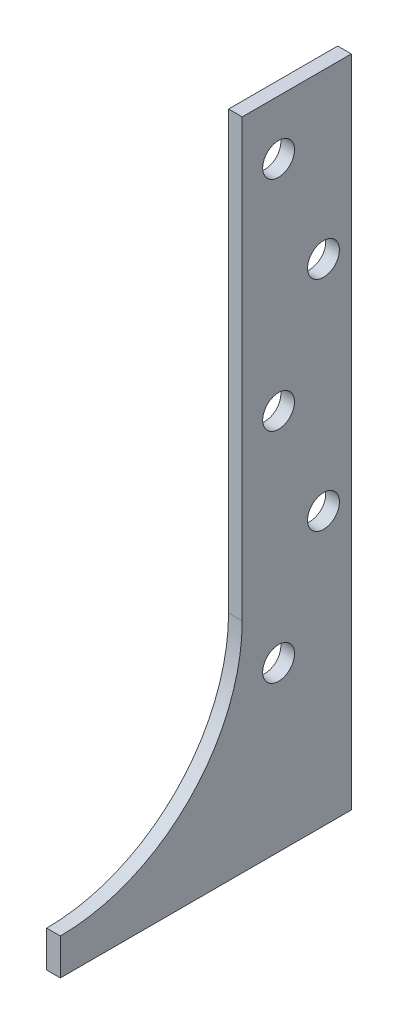
ISO-10303-21;
HEADER;
FILE_DESCRIPTION(('STEP AP214'),'2;1');
FILE_NAME('part.step','',(''),(''),'','','');
FILE_SCHEMA(('AUTOMOTIVE_DESIGN { 1 0 10303 214 1 1 1 1 }'));
ENDSEC;
DATA;
#1=APPLICATION_CONTEXT('core data for automotive mechanical design processes');
#2=APPLICATION_PROTOCOL_DEFINITION('international standard','automotive_design',2000,#1);
#3=PRODUCT_CONTEXT('',#1,'mechanical');
#4=PRODUCT('Part','Part','',(#3));
#5=PRODUCT_RELATED_PRODUCT_CATEGORY('part','',(#4));
#6=PRODUCT_DEFINITION_FORMATION('','',#4);
#7=PRODUCT_DEFINITION_CONTEXT('part definition',#1,'design');
#8=PRODUCT_DEFINITION('design','',#6,#7);
#9=PRODUCT_DEFINITION_SHAPE('','',#8);
#10=(LENGTH_UNIT() NAMED_UNIT(*) SI_UNIT(.MILLI.,.METRE.));
#11=(NAMED_UNIT(*) PLANE_ANGLE_UNIT() SI_UNIT($,.RADIAN.));
#12=(NAMED_UNIT(*) SI_UNIT($,.STERADIAN.) SOLID_ANGLE_UNIT());
#13=UNCERTAINTY_MEASURE_WITH_UNIT(LENGTH_MEASURE(1.E-05),#10,'distance_accuracy_value','');
#14=(GEOMETRIC_REPRESENTATION_CONTEXT(3) GLOBAL_UNCERTAINTY_ASSIGNED_CONTEXT((#13)) GLOBAL_UNIT_ASSIGNED_CONTEXT((#10,
#11,#12)) REPRESENTATION_CONTEXT('',''));
#15=CARTESIAN_POINT('',(0.,0.,0.));
#16=DIRECTION('',(0.,0.,1.));
#17=DIRECTION('',(1.,0.,0.));
#18=AXIS2_PLACEMENT_3D('',#15,#16,#17);
#19=CARTESIAN_POINT('',(19.05,304.8,406.4));
#20=DIRECTION('',(-1.,0.,0.));
#21=DIRECTION('',(0.,0.,1.));
#22=AXIS2_PLACEMENT_3D('',#19,#20,#21);
#23=PLANE('',#22);
#24=CARTESIAN_POINT('',(19.05,533.4,101.6));
#25=DIRECTION('',(1.,0.,0.));
#26=DIRECTION('',(0.,0.,-1.));
#27=AXIS2_PLACEMENT_3D('',#24,#25,#26);
#28=CIRCLE('',#27,22.225);
#29=CARTESIAN_POINT('',(19.05,533.4,123.825));
#30=VERTEX_POINT('',#29);
#31=EDGE_CURVE('E193',#30,#30,#28,.T.);
#32=ORIENTED_EDGE('',*,*,#31,.F.);
#33=EDGE_LOOP('',(#32));
#34=FACE_BOUND('',#33,.T.);
#35=CARTESIAN_POINT('',(19.05,838.2,101.6));
#36=DIRECTION('',(1.,0.,0.));
#37=DIRECTION('',(0.,0.,-1.));
#38=AXIS2_PLACEMENT_3D('',#35,#36,#37);
#39=CIRCLE('',#38,22.225);
#40=CARTESIAN_POINT('',(19.05,838.2,123.825));
#41=VERTEX_POINT('',#40);
#42=EDGE_CURVE('E205',#41,#41,#39,.T.);
#43=ORIENTED_EDGE('',*,*,#42,.F.);
#44=EDGE_LOOP('',(#43));
#45=FACE_BOUND('',#44,.T.);
#46=DIRECTION('',(0.,1.,0.));
#47=VECTOR('',#46,1.);
#48=CARTESIAN_POINT('',(19.05,914.4,0.));
#49=LINE('',#48,#47);
#50=CARTESIAN_POINT('',(19.05,0.,0.));
#51=VERTEX_POINT('',#50);
#52=CARTESIAN_POINT('',(19.05,914.4,0.));
#53=VERTEX_POINT('',#52);
#54=EDGE_CURVE('E128',#51,#53,#49,.T.);
#55=ORIENTED_EDGE('',*,*,#54,.T.);
#56=DIRECTION('',(0.,0.,1.));
#57=VECTOR('',#56,1.);
#58=CARTESIAN_POINT('',(19.05,914.4,152.4));
#59=LINE('',#58,#57);
#60=CARTESIAN_POINT('',(19.05,914.4,152.4));
#61=VERTEX_POINT('',#60);
#62=EDGE_CURVE('E86',#53,#61,#59,.T.);
#63=ORIENTED_EDGE('',*,*,#62,.T.);
#64=DIRECTION('',(0.,-1.,0.));
#65=VECTOR('',#64,1.);
#66=CARTESIAN_POINT('',(19.05,914.4,152.4));
#67=LINE('',#66,#65);
#68=CARTESIAN_POINT('',(19.05,304.8,152.4));
#69=VERTEX_POINT('',#68);
#70=EDGE_CURVE('E99',#61,#69,#67,.T.);
#71=ORIENTED_EDGE('',*,*,#70,.T.);
#72=CARTESIAN_POINT('',(19.05,304.8,406.4));
#73=DIRECTION('',(-1.,0.,0.));
#74=DIRECTION('',(0.,0.,1.));
#75=AXIS2_PLACEMENT_3D('',#72,#73,#74);
#76=CIRCLE('',#75,254.);
#77=CARTESIAN_POINT('',(19.05,50.7999999999999,406.4));
#78=VERTEX_POINT('',#77);
#79=EDGE_CURVE('E93',#69,#78,#76,.T.);
#80=ORIENTED_EDGE('',*,*,#79,.T.);
#81=DIRECTION('',(0.,-1.,0.));
#82=VECTOR('',#81,1.);
#83=CARTESIAN_POINT('',(19.05,0.,406.4));
#84=LINE('',#83,#82);
#85=CARTESIAN_POINT('',(19.05,0.,406.4));
#86=VERTEX_POINT('',#85);
#87=EDGE_CURVE('E97',#78,#86,#84,.T.);
#88=ORIENTED_EDGE('',*,*,#87,.T.);
#89=DIRECTION('',(0.,0.,-1.));
#90=VECTOR('',#89,1.);
#91=CARTESIAN_POINT('',(19.05,0.,0.));
#92=LINE('',#91,#90);
#93=EDGE_CURVE('E49',#86,#51,#92,.T.);
#94=ORIENTED_EDGE('',*,*,#93,.T.);
#95=EDGE_LOOP('',(#55,#63,#71,#80,#88,#94));
#96=FACE_BOUND('',#95,.T.);
#97=CARTESIAN_POINT('',(19.05,685.8,38.8738267968174));
#98=DIRECTION('',(1.,0.,0.));
#99=DIRECTION('',(0.,0.,-1.));
#100=AXIS2_PLACEMENT_3D('',#97,#98,#99);
#101=CIRCLE('',#100,22.225);
#102=CARTESIAN_POINT('',(19.05,685.8,61.0988267968174));
#103=VERTEX_POINT('',#102);
#104=EDGE_CURVE('E121',#103,#103,#101,.T.);
#105=ORIENTED_EDGE('',*,*,#104,.F.);
#106=EDGE_LOOP('',(#105));
#107=FACE_BOUND('',#106,.T.);
#108=CARTESIAN_POINT('',(19.05,381.,38.8738267968174));
#109=DIRECTION('',(1.,0.,0.));
#110=DIRECTION('',(0.,0.,-1.));
#111=AXIS2_PLACEMENT_3D('',#108,#109,#110);
#112=CIRCLE('',#111,22.225);
#113=CARTESIAN_POINT('',(19.05,381.,61.0988267968174));
#114=VERTEX_POINT('',#113);
#115=EDGE_CURVE('E199',#114,#114,#112,.T.);
#116=ORIENTED_EDGE('',*,*,#115,.F.);
#117=EDGE_LOOP('',(#116));
#118=FACE_BOUND('',#117,.T.);
#119=CARTESIAN_POINT('',(19.05,228.6,101.6));
#120=DIRECTION('',(1.,0.,0.));
#121=DIRECTION('',(0.,0.,-1.));
#122=AXIS2_PLACEMENT_3D('',#119,#120,#121);
#123=CIRCLE('',#122,22.225);
#124=CARTESIAN_POINT('',(19.05,228.6,123.825));
#125=VERTEX_POINT('',#124);
#126=EDGE_CURVE('E184',#125,#125,#123,.T.);
#127=ORIENTED_EDGE('',*,*,#126,.F.);
#128=EDGE_LOOP('',(#127));
#129=FACE_BOUND('',#128,.T.);
#130=ADVANCED_FACE('F32',(#34,#45,#96,#107,#118,#129),#23,.F.);
#131=CARTESIAN_POINT('',(0.,304.8,406.4));
#132=DIRECTION('',(-1.,0.,0.));
#133=DIRECTION('',(0.,0.,1.));
#134=AXIS2_PLACEMENT_3D('',#131,#132,#133);
#135=PLANE('',#134);
#136=CARTESIAN_POINT('',(0.,533.4,101.6));
#137=DIRECTION('',(1.,0.,0.));
#138=DIRECTION('',(0.,0.,-1.));
#139=AXIS2_PLACEMENT_3D('',#136,#137,#138);
#140=CIRCLE('',#139,22.225);
#141=CARTESIAN_POINT('',(0.,533.4,123.825));
#142=VERTEX_POINT('',#141);
#143=EDGE_CURVE('E190',#142,#142,#140,.T.);
#144=ORIENTED_EDGE('',*,*,#143,.T.);
#145=EDGE_LOOP('',(#144));
#146=FACE_BOUND('',#145,.T.);
#147=CARTESIAN_POINT('',(0.,838.2,101.6));
#148=DIRECTION('',(1.,0.,0.));
#149=DIRECTION('',(0.,0.,-1.));
#150=AXIS2_PLACEMENT_3D('',#147,#148,#149);
#151=CIRCLE('',#150,22.225);
#152=CARTESIAN_POINT('',(0.,838.2,123.825));
#153=VERTEX_POINT('',#152);
#154=EDGE_CURVE('E202',#153,#153,#151,.T.);
#155=ORIENTED_EDGE('',*,*,#154,.T.);
#156=EDGE_LOOP('',(#155));
#157=FACE_BOUND('',#156,.T.);
#158=DIRECTION('',(0.,1.,0.));
#159=VECTOR('',#158,1.);
#160=CARTESIAN_POINT('',(0.,914.4,0.));
#161=LINE('',#160,#159);
#162=CARTESIAN_POINT('',(0.,0.,0.));
#163=VERTEX_POINT('',#162);
#164=CARTESIAN_POINT('',(0.,914.4,0.));
#165=VERTEX_POINT('',#164);
#166=EDGE_CURVE('E117',#163,#165,#161,.T.);
#167=ORIENTED_EDGE('',*,*,#166,.F.);
#168=DIRECTION('',(0.,0.,-1.));
#169=VECTOR('',#168,1.);
#170=CARTESIAN_POINT('',(0.,0.,0.));
#171=LINE('',#170,#169);
#172=CARTESIAN_POINT('',(0.,0.,406.4));
#173=VERTEX_POINT('',#172);
#174=EDGE_CURVE('E78',#173,#163,#171,.T.);
#175=ORIENTED_EDGE('',*,*,#174,.F.);
#176=DIRECTION('',(0.,-1.,0.));
#177=VECTOR('',#176,1.);
#178=CARTESIAN_POINT('',(0.,0.,406.4));
#179=LINE('',#178,#177);
#180=CARTESIAN_POINT('',(0.,50.7999999999999,406.4));
#181=VERTEX_POINT('',#180);
#182=EDGE_CURVE('E72',#181,#173,#179,.T.);
#183=ORIENTED_EDGE('',*,*,#182,.F.);
#184=CARTESIAN_POINT('',(0.,304.8,406.4));
#185=DIRECTION('',(-1.,0.,0.));
#186=DIRECTION('',(0.,0.,1.));
#187=AXIS2_PLACEMENT_3D('',#184,#185,#186);
#188=CIRCLE('',#187,254.);
#189=CARTESIAN_POINT('',(0.,304.8,152.4));
#190=VERTEX_POINT('',#189);
#191=EDGE_CURVE('E107',#190,#181,#188,.T.);
#192=ORIENTED_EDGE('',*,*,#191,.F.);
#193=DIRECTION('',(0.,-1.,0.));
#194=VECTOR('',#193,1.);
#195=CARTESIAN_POINT('',(0.,914.4,152.4));
#196=LINE('',#195,#194);
#197=CARTESIAN_POINT('',(0.,914.4,152.4));
#198=VERTEX_POINT('',#197);
#199=EDGE_CURVE('E123',#198,#190,#196,.T.);
#200=ORIENTED_EDGE('',*,*,#199,.F.);
#201=DIRECTION('',(0.,0.,1.));
#202=VECTOR('',#201,1.);
#203=CARTESIAN_POINT('',(0.,914.4,152.4));
#204=LINE('',#203,#202);
#205=EDGE_CURVE('E120',#165,#198,#204,.T.);
#206=ORIENTED_EDGE('',*,*,#205,.F.);
#207=EDGE_LOOP('',(#167,#175,#183,#192,#200,#206));
#208=FACE_BOUND('',#207,.T.);
#209=CARTESIAN_POINT('',(0.,685.8,38.8738267968174));
#210=DIRECTION('',(1.,0.,0.));
#211=DIRECTION('',(0.,0.,-1.));
#212=AXIS2_PLACEMENT_3D('',#209,#210,#211);
#213=CIRCLE('',#212,22.225);
#214=CARTESIAN_POINT('',(0.,685.8,61.0988267968174));
#215=VERTEX_POINT('',#214);
#216=EDGE_CURVE('E208',#215,#215,#213,.T.);
#217=ORIENTED_EDGE('',*,*,#216,.T.);
#218=EDGE_LOOP('',(#217));
#219=FACE_BOUND('',#218,.T.);
#220=CARTESIAN_POINT('',(0.,381.,38.8738267968174));
#221=DIRECTION('',(1.,0.,0.));
#222=DIRECTION('',(0.,0.,-1.));
#223=AXIS2_PLACEMENT_3D('',#220,#221,#222);
#224=CIRCLE('',#223,22.225);
#225=CARTESIAN_POINT('',(0.,381.,61.0988267968174));
#226=VERTEX_POINT('',#225);
#227=EDGE_CURVE('E196',#226,#226,#224,.T.);
#228=ORIENTED_EDGE('',*,*,#227,.T.);
#229=EDGE_LOOP('',(#228));
#230=FACE_BOUND('',#229,.T.);
#231=CARTESIAN_POINT('',(0.,228.6,101.6));
#232=DIRECTION('',(1.,0.,0.));
#233=DIRECTION('',(0.,0.,-1.));
#234=AXIS2_PLACEMENT_3D('',#231,#232,#233);
#235=CIRCLE('',#234,22.225);
#236=CARTESIAN_POINT('',(0.,228.6,123.825));
#237=VERTEX_POINT('',#236);
#238=EDGE_CURVE('E187',#237,#237,#235,.T.);
#239=ORIENTED_EDGE('',*,*,#238,.T.);
#240=EDGE_LOOP('',(#239));
#241=FACE_BOUND('',#240,.T.);
#242=ADVANCED_FACE('F137',(#146,#157,#208,#219,#230,#241),#135,.T.);
#243=CARTESIAN_POINT('',(19.05,914.4,0.));
#244=DIRECTION('',(0.,0.,1.));
#245=DIRECTION('',(0.,-1.,0.));
#246=AXIS2_PLACEMENT_3D('',#243,#244,#245);
#247=PLANE('',#246);
#248=ORIENTED_EDGE('',*,*,#166,.T.);
#249=DIRECTION('',(-1.,0.,0.));
#250=VECTOR('',#249,1.);
#251=CARTESIAN_POINT('',(19.05,914.4,0.));
#252=LINE('',#251,#250);
#253=EDGE_CURVE('E11',#53,#165,#252,.T.);
#254=ORIENTED_EDGE('',*,*,#253,.F.);
#255=ORIENTED_EDGE('',*,*,#54,.F.);
#256=DIRECTION('',(-1.,0.,0.));
#257=VECTOR('',#256,1.);
#258=CARTESIAN_POINT('',(19.05,0.,0.));
#259=LINE('',#258,#257);
#260=EDGE_CURVE('E113',#51,#163,#259,.T.);
#261=ORIENTED_EDGE('',*,*,#260,.T.);
#262=EDGE_LOOP('',(#248,#254,#255,#261));
#263=FACE_BOUND('',#262,.T.);
#264=ADVANCED_FACE('F34',(#263),#247,.F.);
#265=CARTESIAN_POINT('',(19.05,914.4,152.4));
#266=DIRECTION('',(0.,-1.,0.));
#267=DIRECTION('',(0.,0.,-1.));
#268=AXIS2_PLACEMENT_3D('',#265,#266,#267);
#269=PLANE('',#268);
#270=ORIENTED_EDGE('',*,*,#205,.T.);
#271=DIRECTION('',(-1.,0.,0.));
#272=VECTOR('',#271,1.);
#273=CARTESIAN_POINT('',(19.05,914.4,152.4));
#274=LINE('',#273,#272);
#275=EDGE_CURVE('E41',#61,#198,#274,.T.);
#276=ORIENTED_EDGE('',*,*,#275,.F.);
#277=ORIENTED_EDGE('',*,*,#62,.F.);
#278=ORIENTED_EDGE('',*,*,#253,.T.);
#279=EDGE_LOOP('',(#270,#276,#277,#278));
#280=FACE_BOUND('',#279,.T.);
#281=ADVANCED_FACE('F274',(#280),#269,.F.);
#282=CARTESIAN_POINT('',(19.05,914.4,152.4));
#283=DIRECTION('',(0.,0.,-1.));
#284=DIRECTION('',(0.,1.,0.));
#285=AXIS2_PLACEMENT_3D('',#282,#283,#284);
#286=PLANE('',#285);
#287=ORIENTED_EDGE('',*,*,#199,.T.);
#288=DIRECTION('',(-1.,0.,0.));
#289=VECTOR('',#288,1.);
#290=CARTESIAN_POINT('',(19.05,304.8,152.4));
#291=LINE('',#290,#289);
#292=EDGE_CURVE('E108',#69,#190,#291,.T.);
#293=ORIENTED_EDGE('',*,*,#292,.F.);
#294=ORIENTED_EDGE('',*,*,#70,.F.);
#295=ORIENTED_EDGE('',*,*,#275,.T.);
#296=EDGE_LOOP('',(#287,#293,#294,#295));
#297=FACE_BOUND('',#296,.T.);
#298=ADVANCED_FACE('F134',(#297),#286,.F.);
#299=CARTESIAN_POINT('',(19.05,304.8,406.4));
#300=DIRECTION('',(-1.,0.,0.));
#301=DIRECTION('',(0.,0.,1.));
#302=AXIS2_PLACEMENT_3D('',#299,#300,#301);
#303=CYLINDRICAL_SURFACE('',#302,254.);
#304=ORIENTED_EDGE('',*,*,#191,.T.);
#305=DIRECTION('',(-1.,0.,0.));
#306=VECTOR('',#305,1.);
#307=CARTESIAN_POINT('',(19.05,50.7999999999999,406.4));
#308=LINE('',#307,#306);
#309=EDGE_CURVE('E104',#78,#181,#308,.T.);
#310=ORIENTED_EDGE('',*,*,#309,.F.);
#311=ORIENTED_EDGE('',*,*,#79,.F.);
#312=ORIENTED_EDGE('',*,*,#292,.T.);
#313=EDGE_LOOP('',(#304,#310,#311,#312));
#314=FACE_BOUND('',#313,.T.);
#315=ADVANCED_FACE('F105',(#314),#303,.F.);
#316=CARTESIAN_POINT('',(19.05,0.,406.4));
#317=DIRECTION('',(0.,0.,-1.));
#318=DIRECTION('',(0.,1.,0.));
#319=AXIS2_PLACEMENT_3D('',#316,#317,#318);
#320=PLANE('',#319);
#321=ORIENTED_EDGE('',*,*,#182,.T.);
#322=DIRECTION('',(-1.,0.,0.));
#323=VECTOR('',#322,1.);
#324=CARTESIAN_POINT('',(19.05,0.,406.4));
#325=LINE('',#324,#323);
#326=EDGE_CURVE('E109',#86,#173,#325,.T.);
#327=ORIENTED_EDGE('',*,*,#326,.F.);
#328=ORIENTED_EDGE('',*,*,#87,.F.);
#329=ORIENTED_EDGE('',*,*,#309,.T.);
#330=EDGE_LOOP('',(#321,#327,#328,#329));
#331=FACE_BOUND('',#330,.T.);
#332=ADVANCED_FACE('F111',(#331),#320,.F.);
#333=CARTESIAN_POINT('',(19.05,0.,0.));
#334=DIRECTION('',(0.,1.,0.));
#335=DIRECTION('',(0.,0.,1.));
#336=AXIS2_PLACEMENT_3D('',#333,#334,#335);
#337=PLANE('',#336);
#338=ORIENTED_EDGE('',*,*,#174,.T.);
#339=ORIENTED_EDGE('',*,*,#260,.F.);
#340=ORIENTED_EDGE('',*,*,#93,.F.);
#341=ORIENTED_EDGE('',*,*,#326,.T.);
#342=EDGE_LOOP('',(#338,#339,#340,#341));
#343=FACE_BOUND('',#342,.T.);
#344=ADVANCED_FACE('F142',(#343),#337,.F.);
#345=CARTESIAN_POINT('',(19.05,685.8,38.8738267968174));
#346=DIRECTION('',(-1.,0.,0.));
#347=DIRECTION('',(0.,0.,1.));
#348=AXIS2_PLACEMENT_3D('',#345,#346,#347);
#349=CYLINDRICAL_SURFACE('',#348,22.225);
#350=CARTESIAN_POINT('',(19.05,685.8,61.0988267968174));
#351=CARTESIAN_POINT('',(18.8515625,685.8,61.0988267968174));
#352=CARTESIAN_POINT('',(18.653125,685.8,61.0988267968174));
#353=CARTESIAN_POINT('',(18.25625,685.8,61.0988267968174));
#354=CARTESIAN_POINT('',(18.0578125,685.8,61.0988267968174));
#355=CARTESIAN_POINT('',(17.6609375,685.8,61.0988267968174));
#356=CARTESIAN_POINT('',(17.4625,685.8,61.0988267968174));
#357=CARTESIAN_POINT('',(17.065625,685.8,61.0988267968174));
#358=CARTESIAN_POINT('',(16.8671875,685.8,61.0988267968174));
#359=CARTESIAN_POINT('',(16.4703125,685.8,61.0988267968174));
#360=CARTESIAN_POINT('',(16.271875,685.8,61.0988267968174));
#361=CARTESIAN_POINT('',(15.875,685.8,61.0988267968174));
#362=CARTESIAN_POINT('',(15.6765625,685.8,61.0988267968174));
#363=CARTESIAN_POINT('',(15.2796875,685.8,61.0988267968174));
#364=CARTESIAN_POINT('',(15.08125,685.8,61.0988267968174));
#365=CARTESIAN_POINT('',(14.684375,685.8,61.0988267968174));
#366=CARTESIAN_POINT('',(14.4859375,685.8,61.0988267968174));
#367=CARTESIAN_POINT('',(14.0890625,685.8,61.0988267968174));
#368=CARTESIAN_POINT('',(13.890625,685.8,61.0988267968174));
#369=CARTESIAN_POINT('',(13.49375,685.8,61.0988267968174));
#370=CARTESIAN_POINT('',(13.2953125,685.8,61.0988267968174));
#371=CARTESIAN_POINT('',(12.8984375,685.8,61.0988267968174));
#372=CARTESIAN_POINT('',(12.7,685.8,61.0988267968174));
#373=CARTESIAN_POINT('',(12.303125,685.8,61.0988267968174));
#374=CARTESIAN_POINT('',(12.1046875,685.8,61.0988267968174));
#375=CARTESIAN_POINT('',(11.7078125,685.8,61.0988267968174));
#376=CARTESIAN_POINT('',(11.509375,685.8,61.0988267968174));
#377=CARTESIAN_POINT('',(11.1125,685.8,61.0988267968174));
#378=CARTESIAN_POINT('',(10.9140625,685.8,61.0988267968174));
#379=CARTESIAN_POINT('',(10.5171875,685.8,61.0988267968174));
#380=CARTESIAN_POINT('',(10.31875,685.8,61.0988267968174));
#381=CARTESIAN_POINT('',(9.921875,685.8,61.0988267968174));
#382=CARTESIAN_POINT('',(9.7234375,685.8,61.0988267968174));
#383=CARTESIAN_POINT('',(9.3265625,685.8,61.0988267968174));
#384=CARTESIAN_POINT('',(9.128125,685.8,61.0988267968174));
#385=CARTESIAN_POINT('',(8.73125,685.8,61.0988267968174));
#386=CARTESIAN_POINT('',(8.5328125,685.8,61.0988267968174));
#387=CARTESIAN_POINT('',(8.1359375,685.8,61.0988267968174));
#388=CARTESIAN_POINT('',(7.9375,685.8,61.0988267968174));
#389=CARTESIAN_POINT('',(7.540625,685.8,61.0988267968174));
#390=CARTESIAN_POINT('',(7.3421875,685.8,61.0988267968174));
#391=CARTESIAN_POINT('',(6.9453125,685.8,61.0988267968174));
#392=CARTESIAN_POINT('',(6.746875,685.8,61.0988267968174));
#393=CARTESIAN_POINT('',(6.35,685.8,61.0988267968174));
#394=CARTESIAN_POINT('',(6.1515625,685.8,61.0988267968174));
#395=CARTESIAN_POINT('',(5.7546875,685.8,61.0988267968174));
#396=CARTESIAN_POINT('',(5.55625,685.8,61.0988267968174));
#397=CARTESIAN_POINT('',(5.159375,685.8,61.0988267968174));
#398=CARTESIAN_POINT('',(4.9609375,685.8,61.0988267968174));
#399=CARTESIAN_POINT('',(4.5640625,685.8,61.0988267968174));
#400=CARTESIAN_POINT('',(4.365625,685.8,61.0988267968174));
#401=CARTESIAN_POINT('',(3.96875,685.8,61.0988267968174));
#402=CARTESIAN_POINT('',(3.7703125,685.8,61.0988267968174));
#403=CARTESIAN_POINT('',(3.3734375,685.8,61.0988267968174));
#404=CARTESIAN_POINT('',(3.175,685.8,61.0988267968174));
#405=CARTESIAN_POINT('',(2.778125,685.8,61.0988267968174));
#406=CARTESIAN_POINT('',(2.5796875,685.8,61.0988267968174));
#407=CARTESIAN_POINT('',(2.1828125,685.8,61.0988267968174));
#408=CARTESIAN_POINT('',(1.984375,685.8,61.0988267968174));
#409=CARTESIAN_POINT('',(1.5875,685.8,61.0988267968174));
#410=CARTESIAN_POINT('',(1.3890625,685.8,61.0988267968174));
#411=CARTESIAN_POINT('',(0.992187500000001,685.8,61.0988267968174));
#412=CARTESIAN_POINT('',(0.793750000000001,685.8,61.0988267968174));
#413=CARTESIAN_POINT('',(0.396875,685.8,61.0988267968174));
#414=CARTESIAN_POINT('',(0.1984375,685.8,61.0988267968174));
#415=CARTESIAN_POINT('',(0.,685.8,61.0988267968174));
#416=B_SPLINE_CURVE_WITH_KNOTS('',3,(#350,#351,#352,#353,#354,#355,#356,#357,#358,#359,#360,
#361,#362,#363,#364,#365,#366,#367,#368,#369,#370,#371,#372,#373,#374,#375,#376,#377,#378,#379,
#380,#381,#382,#383,#384,#385,#386,#387,#388,#389,#390,#391,#392,#393,#394,#395,#396,#397,#398,
#399,#400,#401,#402,#403,#404,#405,#406,#407,#408,#409,#410,#411,#412,#413,#414,#415),
.UNSPECIFIED.,.F.,.F.,(4,2,2,2,2,2,2,2,2,2,2,2,2,2,2,2,2,2,2,2,2,2,2,2,2,2,2,2,2,2,2,2,4),(0.,
0.595312499999997,1.190625,1.7859375,2.38125,2.9765625,3.571875,4.1671875,4.7625,5.3578125,
5.953125,6.5484375,7.14375,7.7390625,8.334375,8.9296875,9.525,10.1203125,10.715625,11.3109375,
11.90625,12.5015625,13.096875,13.6921875,14.2875,14.8828125,15.478125,16.0734375,16.66875,
17.2640625,17.859375,18.4546875,19.05),.UNSPECIFIED.);
#417=EDGE_CURVE('BSEAM144',#103,#215,#416,.T.);
#418=ORIENTED_EDGE('',*,*,#104,.T.);
#419=ORIENTED_EDGE('',*,*,#216,.F.);
#420=ORIENTED_EDGE('',*,*,#417,.T.);
#421=ORIENTED_EDGE('',*,*,#417,.F.);
#422=EDGE_LOOP('',(#418,#420,#419,#421));
#423=FACE_BOUND('',#422,.T.);
#424=ADVANCED_FACE('F144',(#423),#349,.F.);
#425=CARTESIAN_POINT('',(19.05,838.2,101.6));
#426=DIRECTION('',(-1.,0.,0.));
#427=DIRECTION('',(0.,0.,1.));
#428=AXIS2_PLACEMENT_3D('',#425,#426,#427);
#429=CYLINDRICAL_SURFACE('',#428,22.225);
#430=CARTESIAN_POINT('',(19.05,838.2,123.825));
#431=CARTESIAN_POINT('',(18.8515625,838.2,123.825));
#432=CARTESIAN_POINT('',(18.653125,838.2,123.825));
#433=CARTESIAN_POINT('',(18.25625,838.2,123.825));
#434=CARTESIAN_POINT('',(18.0578125,838.2,123.825));
#435=CARTESIAN_POINT('',(17.6609375,838.2,123.825));
#436=CARTESIAN_POINT('',(17.4625,838.2,123.825));
#437=CARTESIAN_POINT('',(17.065625,838.2,123.825));
#438=CARTESIAN_POINT('',(16.8671875,838.2,123.825));
#439=CARTESIAN_POINT('',(16.4703125,838.2,123.825));
#440=CARTESIAN_POINT('',(16.271875,838.2,123.825));
#441=CARTESIAN_POINT('',(15.875,838.2,123.825));
#442=CARTESIAN_POINT('',(15.6765625,838.2,123.825));
#443=CARTESIAN_POINT('',(15.2796875,838.2,123.825));
#444=CARTESIAN_POINT('',(15.08125,838.2,123.825));
#445=CARTESIAN_POINT('',(14.684375,838.2,123.825));
#446=CARTESIAN_POINT('',(14.4859375,838.2,123.825));
#447=CARTESIAN_POINT('',(14.0890625,838.2,123.825));
#448=CARTESIAN_POINT('',(13.890625,838.2,123.825));
#449=CARTESIAN_POINT('',(13.49375,838.2,123.825));
#450=CARTESIAN_POINT('',(13.2953125,838.2,123.825));
#451=CARTESIAN_POINT('',(12.8984375,838.2,123.825));
#452=CARTESIAN_POINT('',(12.7,838.2,123.825));
#453=CARTESIAN_POINT('',(12.303125,838.2,123.825));
#454=CARTESIAN_POINT('',(12.1046875,838.2,123.825));
#455=CARTESIAN_POINT('',(11.7078125,838.2,123.825));
#456=CARTESIAN_POINT('',(11.509375,838.2,123.825));
#457=CARTESIAN_POINT('',(11.1125,838.2,123.825));
#458=CARTESIAN_POINT('',(10.9140625,838.2,123.825));
#459=CARTESIAN_POINT('',(10.5171875,838.2,123.825));
#460=CARTESIAN_POINT('',(10.31875,838.2,123.825));
#461=CARTESIAN_POINT('',(9.921875,838.2,123.825));
#462=CARTESIAN_POINT('',(9.7234375,838.2,123.825));
#463=CARTESIAN_POINT('',(9.3265625,838.2,123.825));
#464=CARTESIAN_POINT('',(9.128125,838.2,123.825));
#465=CARTESIAN_POINT('',(8.73125,838.2,123.825));
#466=CARTESIAN_POINT('',(8.5328125,838.2,123.825));
#467=CARTESIAN_POINT('',(8.1359375,838.2,123.825));
#468=CARTESIAN_POINT('',(7.9375,838.2,123.825));
#469=CARTESIAN_POINT('',(7.540625,838.2,123.825));
#470=CARTESIAN_POINT('',(7.3421875,838.2,123.825));
#471=CARTESIAN_POINT('',(6.9453125,838.2,123.825));
#472=CARTESIAN_POINT('',(6.746875,838.2,123.825));
#473=CARTESIAN_POINT('',(6.35,838.2,123.825));
#474=CARTESIAN_POINT('',(6.1515625,838.2,123.825));
#475=CARTESIAN_POINT('',(5.7546875,838.2,123.825));
#476=CARTESIAN_POINT('',(5.55625,838.2,123.825));
#477=CARTESIAN_POINT('',(5.159375,838.2,123.825));
#478=CARTESIAN_POINT('',(4.9609375,838.2,123.825));
#479=CARTESIAN_POINT('',(4.5640625,838.2,123.825));
#480=CARTESIAN_POINT('',(4.365625,838.2,123.825));
#481=CARTESIAN_POINT('',(3.96875,838.2,123.825));
#482=CARTESIAN_POINT('',(3.7703125,838.2,123.825));
#483=CARTESIAN_POINT('',(3.3734375,838.2,123.825));
#484=CARTESIAN_POINT('',(3.175,838.2,123.825));
#485=CARTESIAN_POINT('',(2.778125,838.2,123.825));
#486=CARTESIAN_POINT('',(2.5796875,838.2,123.825));
#487=CARTESIAN_POINT('',(2.1828125,838.2,123.825));
#488=CARTESIAN_POINT('',(1.984375,838.2,123.825));
#489=CARTESIAN_POINT('',(1.5875,838.2,123.825));
#490=CARTESIAN_POINT('',(1.3890625,838.2,123.825));
#491=CARTESIAN_POINT('',(0.992187500000001,838.2,123.825));
#492=CARTESIAN_POINT('',(0.793750000000001,838.2,123.825));
#493=CARTESIAN_POINT('',(0.396875,838.2,123.825));
#494=CARTESIAN_POINT('',(0.1984375,838.2,123.825));
#495=CARTESIAN_POINT('',(0.,838.2,123.825));
#496=B_SPLINE_CURVE_WITH_KNOTS('',3,(#430,#431,#432,#433,#434,#435,#436,#437,#438,#439,#440,
#441,#442,#443,#444,#445,#446,#447,#448,#449,#450,#451,#452,#453,#454,#455,#456,#457,#458,#459,
#460,#461,#462,#463,#464,#465,#466,#467,#468,#469,#470,#471,#472,#473,#474,#475,#476,#477,#478,
#479,#480,#481,#482,#483,#484,#485,#486,#487,#488,#489,#490,#491,#492,#493,#494,#495),
.UNSPECIFIED.,.F.,.F.,(4,2,2,2,2,2,2,2,2,2,2,2,2,2,2,2,2,2,2,2,2,2,2,2,2,2,2,2,2,2,2,2,4),(0.,
0.595312499999997,1.190625,1.7859375,2.38125,2.9765625,3.571875,4.1671875,4.7625,5.3578125,
5.953125,6.5484375,7.14375,7.7390625,8.334375,8.9296875,9.525,10.1203125,10.715625,11.3109375,
11.90625,12.5015625,13.096875,13.6921875,14.2875,14.8828125,15.478125,16.0734375,16.66875,
17.2640625,17.859375,18.4546875,19.05),.UNSPECIFIED.);
#497=EDGE_CURVE('BSEAM150',#41,#153,#496,.T.);
#498=ORIENTED_EDGE('',*,*,#42,.T.);
#499=ORIENTED_EDGE('',*,*,#154,.F.);
#500=ORIENTED_EDGE('',*,*,#497,.T.);
#501=ORIENTED_EDGE('',*,*,#497,.F.);
#502=EDGE_LOOP('',(#498,#500,#499,#501));
#503=FACE_BOUND('',#502,.T.);
#504=ADVANCED_FACE('F150',(#503),#429,.F.);
#505=CARTESIAN_POINT('',(19.05,381.,38.8738267968174));
#506=DIRECTION('',(-1.,0.,0.));
#507=DIRECTION('',(0.,0.,1.));
#508=AXIS2_PLACEMENT_3D('',#505,#506,#507);
#509=CYLINDRICAL_SURFACE('',#508,22.225);
#510=CARTESIAN_POINT('',(19.05,381.,61.0988267968174));
#511=CARTESIAN_POINT('',(18.8515625,381.,61.0988267968174));
#512=CARTESIAN_POINT('',(18.653125,381.,61.0988267968174));
#513=CARTESIAN_POINT('',(18.25625,381.,61.0988267968174));
#514=CARTESIAN_POINT('',(18.0578125,381.,61.0988267968174));
#515=CARTESIAN_POINT('',(17.6609375,381.,61.0988267968174));
#516=CARTESIAN_POINT('',(17.4625,381.,61.0988267968174));
#517=CARTESIAN_POINT('',(17.065625,381.,61.0988267968174));
#518=CARTESIAN_POINT('',(16.8671875,381.,61.0988267968174));
#519=CARTESIAN_POINT('',(16.4703125,381.,61.0988267968174));
#520=CARTESIAN_POINT('',(16.271875,381.,61.0988267968174));
#521=CARTESIAN_POINT('',(15.875,381.,61.0988267968174));
#522=CARTESIAN_POINT('',(15.6765625,381.,61.0988267968174));
#523=CARTESIAN_POINT('',(15.2796875,381.,61.0988267968174));
#524=CARTESIAN_POINT('',(15.08125,381.,61.0988267968174));
#525=CARTESIAN_POINT('',(14.684375,381.,61.0988267968174));
#526=CARTESIAN_POINT('',(14.4859375,381.,61.0988267968174));
#527=CARTESIAN_POINT('',(14.0890625,381.,61.0988267968174));
#528=CARTESIAN_POINT('',(13.890625,381.,61.0988267968174));
#529=CARTESIAN_POINT('',(13.49375,381.,61.0988267968174));
#530=CARTESIAN_POINT('',(13.2953125,381.,61.0988267968174));
#531=CARTESIAN_POINT('',(12.8984375,381.,61.0988267968174));
#532=CARTESIAN_POINT('',(12.7,381.,61.0988267968174));
#533=CARTESIAN_POINT('',(12.303125,381.,61.0988267968174));
#534=CARTESIAN_POINT('',(12.1046875,381.,61.0988267968174));
#535=CARTESIAN_POINT('',(11.7078125,381.,61.0988267968174));
#536=CARTESIAN_POINT('',(11.509375,381.,61.0988267968174));
#537=CARTESIAN_POINT('',(11.1125,381.,61.0988267968174));
#538=CARTESIAN_POINT('',(10.9140625,381.,61.0988267968174));
#539=CARTESIAN_POINT('',(10.5171875,381.,61.0988267968174));
#540=CARTESIAN_POINT('',(10.31875,381.,61.0988267968174));
#541=CARTESIAN_POINT('',(9.921875,381.,61.0988267968174));
#542=CARTESIAN_POINT('',(9.7234375,381.,61.0988267968174));
#543=CARTESIAN_POINT('',(9.3265625,381.,61.0988267968174));
#544=CARTESIAN_POINT('',(9.128125,381.,61.0988267968174));
#545=CARTESIAN_POINT('',(8.73125,381.,61.0988267968174));
#546=CARTESIAN_POINT('',(8.5328125,381.,61.0988267968174));
#547=CARTESIAN_POINT('',(8.1359375,381.,61.0988267968174));
#548=CARTESIAN_POINT('',(7.9375,381.,61.0988267968174));
#549=CARTESIAN_POINT('',(7.540625,381.,61.0988267968174));
#550=CARTESIAN_POINT('',(7.3421875,381.,61.0988267968174));
#551=CARTESIAN_POINT('',(6.9453125,381.,61.0988267968174));
#552=CARTESIAN_POINT('',(6.746875,381.,61.0988267968174));
#553=CARTESIAN_POINT('',(6.35,381.,61.0988267968174));
#554=CARTESIAN_POINT('',(6.1515625,381.,61.0988267968174));
#555=CARTESIAN_POINT('',(5.7546875,381.,61.0988267968174));
#556=CARTESIAN_POINT('',(5.55625,381.,61.0988267968174));
#557=CARTESIAN_POINT('',(5.159375,381.,61.0988267968174));
#558=CARTESIAN_POINT('',(4.9609375,381.,61.0988267968174));
#559=CARTESIAN_POINT('',(4.5640625,381.,61.0988267968174));
#560=CARTESIAN_POINT('',(4.365625,381.,61.0988267968174));
#561=CARTESIAN_POINT('',(3.96875,381.,61.0988267968174));
#562=CARTESIAN_POINT('',(3.7703125,381.,61.0988267968174));
#563=CARTESIAN_POINT('',(3.3734375,381.,61.0988267968174));
#564=CARTESIAN_POINT('',(3.175,381.,61.0988267968174));
#565=CARTESIAN_POINT('',(2.778125,381.,61.0988267968174));
#566=CARTESIAN_POINT('',(2.5796875,381.,61.0988267968174));
#567=CARTESIAN_POINT('',(2.1828125,381.,61.0988267968174));
#568=CARTESIAN_POINT('',(1.984375,381.,61.0988267968174));
#569=CARTESIAN_POINT('',(1.5875,381.,61.0988267968174));
#570=CARTESIAN_POINT('',(1.3890625,381.,61.0988267968174));
#571=CARTESIAN_POINT('',(0.992187500000001,381.,61.0988267968174));
#572=CARTESIAN_POINT('',(0.793750000000001,381.,61.0988267968174));
#573=CARTESIAN_POINT('',(0.396875,381.,61.0988267968174));
#574=CARTESIAN_POINT('',(0.1984375,381.,61.0988267968174));
#575=CARTESIAN_POINT('',(0.,381.,61.0988267968174));
#576=B_SPLINE_CURVE_WITH_KNOTS('',3,(#510,#511,#512,#513,#514,#515,#516,#517,#518,#519,#520,
#521,#522,#523,#524,#525,#526,#527,#528,#529,#530,#531,#532,#533,#534,#535,#536,#537,#538,#539,
#540,#541,#542,#543,#544,#545,#546,#547,#548,#549,#550,#551,#552,#553,#554,#555,#556,#557,#558,
#559,#560,#561,#562,#563,#564,#565,#566,#567,#568,#569,#570,#571,#572,#573,#574,#575),
.UNSPECIFIED.,.F.,.F.,(4,2,2,2,2,2,2,2,2,2,2,2,2,2,2,2,2,2,2,2,2,2,2,2,2,2,2,2,2,2,2,2,4),(0.,
0.595312499999997,1.190625,1.7859375,2.38125,2.9765625,3.571875,4.1671875,4.7625,5.3578125,
5.953125,6.5484375,7.14375,7.7390625,8.334375,8.9296875,9.525,10.1203125,10.715625,11.3109375,
11.90625,12.5015625,13.096875,13.6921875,14.2875,14.8828125,15.478125,16.0734375,16.66875,
17.2640625,17.859375,18.4546875,19.05),.UNSPECIFIED.);
#577=EDGE_CURVE('BSEAM167',#114,#226,#576,.T.);
#578=ORIENTED_EDGE('',*,*,#115,.T.);
#579=ORIENTED_EDGE('',*,*,#227,.F.);
#580=ORIENTED_EDGE('',*,*,#577,.T.);
#581=ORIENTED_EDGE('',*,*,#577,.F.);
#582=EDGE_LOOP('',(#578,#580,#579,#581));
#583=FACE_BOUND('',#582,.T.);
#584=ADVANCED_FACE('F167',(#583),#509,.F.);
#585=CARTESIAN_POINT('',(19.05,533.4,101.6));
#586=DIRECTION('',(-1.,0.,0.));
#587=DIRECTION('',(0.,0.,1.));
#588=AXIS2_PLACEMENT_3D('',#585,#586,#587);
#589=CYLINDRICAL_SURFACE('',#588,22.225);
#590=CARTESIAN_POINT('',(19.05,533.4,123.825));
#591=CARTESIAN_POINT('',(18.8515625,533.4,123.825));
#592=CARTESIAN_POINT('',(18.653125,533.4,123.825));
#593=CARTESIAN_POINT('',(18.25625,533.4,123.825));
#594=CARTESIAN_POINT('',(18.0578125,533.4,123.825));
#595=CARTESIAN_POINT('',(17.6609375,533.4,123.825));
#596=CARTESIAN_POINT('',(17.4625,533.4,123.825));
#597=CARTESIAN_POINT('',(17.065625,533.4,123.825));
#598=CARTESIAN_POINT('',(16.8671875,533.4,123.825));
#599=CARTESIAN_POINT('',(16.4703125,533.4,123.825));
#600=CARTESIAN_POINT('',(16.271875,533.4,123.825));
#601=CARTESIAN_POINT('',(15.875,533.4,123.825));
#602=CARTESIAN_POINT('',(15.6765625,533.4,123.825));
#603=CARTESIAN_POINT('',(15.2796875,533.4,123.825));
#604=CARTESIAN_POINT('',(15.08125,533.4,123.825));
#605=CARTESIAN_POINT('',(14.684375,533.4,123.825));
#606=CARTESIAN_POINT('',(14.4859375,533.4,123.825));
#607=CARTESIAN_POINT('',(14.0890625,533.4,123.825));
#608=CARTESIAN_POINT('',(13.890625,533.4,123.825));
#609=CARTESIAN_POINT('',(13.49375,533.4,123.825));
#610=CARTESIAN_POINT('',(13.2953125,533.4,123.825));
#611=CARTESIAN_POINT('',(12.8984375,533.4,123.825));
#612=CARTESIAN_POINT('',(12.7,533.4,123.825));
#613=CARTESIAN_POINT('',(12.303125,533.4,123.825));
#614=CARTESIAN_POINT('',(12.1046875,533.4,123.825));
#615=CARTESIAN_POINT('',(11.7078125,533.4,123.825));
#616=CARTESIAN_POINT('',(11.509375,533.4,123.825));
#617=CARTESIAN_POINT('',(11.1125,533.4,123.825));
#618=CARTESIAN_POINT('',(10.9140625,533.4,123.825));
#619=CARTESIAN_POINT('',(10.5171875,533.4,123.825));
#620=CARTESIAN_POINT('',(10.31875,533.4,123.825));
#621=CARTESIAN_POINT('',(9.921875,533.4,123.825));
#622=CARTESIAN_POINT('',(9.7234375,533.4,123.825));
#623=CARTESIAN_POINT('',(9.3265625,533.4,123.825));
#624=CARTESIAN_POINT('',(9.128125,533.4,123.825));
#625=CARTESIAN_POINT('',(8.73125,533.4,123.825));
#626=CARTESIAN_POINT('',(8.5328125,533.4,123.825));
#627=CARTESIAN_POINT('',(8.1359375,533.4,123.825));
#628=CARTESIAN_POINT('',(7.9375,533.4,123.825));
#629=CARTESIAN_POINT('',(7.540625,533.4,123.825));
#630=CARTESIAN_POINT('',(7.3421875,533.4,123.825));
#631=CARTESIAN_POINT('',(6.9453125,533.4,123.825));
#632=CARTESIAN_POINT('',(6.746875,533.4,123.825));
#633=CARTESIAN_POINT('',(6.35,533.4,123.825));
#634=CARTESIAN_POINT('',(6.1515625,533.4,123.825));
#635=CARTESIAN_POINT('',(5.7546875,533.4,123.825));
#636=CARTESIAN_POINT('',(5.55625,533.4,123.825));
#637=CARTESIAN_POINT('',(5.159375,533.4,123.825));
#638=CARTESIAN_POINT('',(4.9609375,533.4,123.825));
#639=CARTESIAN_POINT('',(4.5640625,533.4,123.825));
#640=CARTESIAN_POINT('',(4.365625,533.4,123.825));
#641=CARTESIAN_POINT('',(3.96875,533.4,123.825));
#642=CARTESIAN_POINT('',(3.7703125,533.4,123.825));
#643=CARTESIAN_POINT('',(3.3734375,533.4,123.825));
#644=CARTESIAN_POINT('',(3.175,533.4,123.825));
#645=CARTESIAN_POINT('',(2.778125,533.4,123.825));
#646=CARTESIAN_POINT('',(2.5796875,533.4,123.825));
#647=CARTESIAN_POINT('',(2.1828125,533.4,123.825));
#648=CARTESIAN_POINT('',(1.984375,533.4,123.825));
#649=CARTESIAN_POINT('',(1.5875,533.4,123.825));
#650=CARTESIAN_POINT('',(1.3890625,533.4,123.825));
#651=CARTESIAN_POINT('',(0.992187500000001,533.4,123.825));
#652=CARTESIAN_POINT('',(0.793750000000001,533.4,123.825));
#653=CARTESIAN_POINT('',(0.396875,533.4,123.825));
#654=CARTESIAN_POINT('',(0.1984375,533.4,123.825));
#655=CARTESIAN_POINT('',(0.,533.4,123.825));
#656=B_SPLINE_CURVE_WITH_KNOTS('',3,(#590,#591,#592,#593,#594,#595,#596,#597,#598,#599,#600,
#601,#602,#603,#604,#605,#606,#607,#608,#609,#610,#611,#612,#613,#614,#615,#616,#617,#618,#619,
#620,#621,#622,#623,#624,#625,#626,#627,#628,#629,#630,#631,#632,#633,#634,#635,#636,#637,#638,
#639,#640,#641,#642,#643,#644,#645,#646,#647,#648,#649,#650,#651,#652,#653,#654,#655),
.UNSPECIFIED.,.F.,.F.,(4,2,2,2,2,2,2,2,2,2,2,2,2,2,2,2,2,2,2,2,2,2,2,2,2,2,2,2,2,2,2,2,4),(0.,
0.595312499999997,1.190625,1.7859375,2.38125,2.9765625,3.571875,4.1671875,4.7625,5.3578125,
5.953125,6.5484375,7.14375,7.7390625,8.334375,8.9296875,9.525,10.1203125,10.715625,11.3109375,
11.90625,12.5015625,13.096875,13.6921875,14.2875,14.8828125,15.478125,16.0734375,16.66875,
17.2640625,17.859375,18.4546875,19.05),.UNSPECIFIED.);
#657=EDGE_CURVE('BSEAM171',#30,#142,#656,.T.);
#658=ORIENTED_EDGE('',*,*,#31,.T.);
#659=ORIENTED_EDGE('',*,*,#143,.F.);
#660=ORIENTED_EDGE('',*,*,#657,.T.);
#661=ORIENTED_EDGE('',*,*,#657,.F.);
#662=EDGE_LOOP('',(#658,#660,#659,#661));
#663=FACE_BOUND('',#662,.T.);
#664=ADVANCED_FACE('F171',(#663),#589,.F.);
#665=CARTESIAN_POINT('',(19.05,228.6,101.6));
#666=DIRECTION('',(-1.,0.,0.));
#667=DIRECTION('',(0.,0.,1.));
#668=AXIS2_PLACEMENT_3D('',#665,#666,#667);
#669=CYLINDRICAL_SURFACE('',#668,22.225);
#670=CARTESIAN_POINT('',(19.05,228.6,123.825));
#671=CARTESIAN_POINT('',(18.8515625,228.6,123.825));
#672=CARTESIAN_POINT('',(18.653125,228.6,123.825));
#673=CARTESIAN_POINT('',(18.25625,228.6,123.825));
#674=CARTESIAN_POINT('',(18.0578125,228.6,123.825));
#675=CARTESIAN_POINT('',(17.6609375,228.6,123.825));
#676=CARTESIAN_POINT('',(17.4625,228.6,123.825));
#677=CARTESIAN_POINT('',(17.065625,228.6,123.825));
#678=CARTESIAN_POINT('',(16.8671875,228.6,123.825));
#679=CARTESIAN_POINT('',(16.4703125,228.6,123.825));
#680=CARTESIAN_POINT('',(16.271875,228.6,123.825));
#681=CARTESIAN_POINT('',(15.875,228.6,123.825));
#682=CARTESIAN_POINT('',(15.6765625,228.6,123.825));
#683=CARTESIAN_POINT('',(15.2796875,228.6,123.825));
#684=CARTESIAN_POINT('',(15.08125,228.6,123.825));
#685=CARTESIAN_POINT('',(14.684375,228.6,123.825));
#686=CARTESIAN_POINT('',(14.4859375,228.6,123.825));
#687=CARTESIAN_POINT('',(14.0890625,228.6,123.825));
#688=CARTESIAN_POINT('',(13.890625,228.6,123.825));
#689=CARTESIAN_POINT('',(13.49375,228.6,123.825));
#690=CARTESIAN_POINT('',(13.2953125,228.6,123.825));
#691=CARTESIAN_POINT('',(12.8984375,228.6,123.825));
#692=CARTESIAN_POINT('',(12.7,228.6,123.825));
#693=CARTESIAN_POINT('',(12.303125,228.6,123.825));
#694=CARTESIAN_POINT('',(12.1046875,228.6,123.825));
#695=CARTESIAN_POINT('',(11.7078125,228.6,123.825));
#696=CARTESIAN_POINT('',(11.509375,228.6,123.825));
#697=CARTESIAN_POINT('',(11.1125,228.6,123.825));
#698=CARTESIAN_POINT('',(10.9140625,228.6,123.825));
#699=CARTESIAN_POINT('',(10.5171875,228.6,123.825));
#700=CARTESIAN_POINT('',(10.31875,228.6,123.825));
#701=CARTESIAN_POINT('',(9.921875,228.6,123.825));
#702=CARTESIAN_POINT('',(9.7234375,228.6,123.825));
#703=CARTESIAN_POINT('',(9.3265625,228.6,123.825));
#704=CARTESIAN_POINT('',(9.128125,228.6,123.825));
#705=CARTESIAN_POINT('',(8.73125,228.6,123.825));
#706=CARTESIAN_POINT('',(8.5328125,228.6,123.825));
#707=CARTESIAN_POINT('',(8.1359375,228.6,123.825));
#708=CARTESIAN_POINT('',(7.9375,228.6,123.825));
#709=CARTESIAN_POINT('',(7.540625,228.6,123.825));
#710=CARTESIAN_POINT('',(7.3421875,228.6,123.825));
#711=CARTESIAN_POINT('',(6.9453125,228.6,123.825));
#712=CARTESIAN_POINT('',(6.746875,228.6,123.825));
#713=CARTESIAN_POINT('',(6.35,228.6,123.825));
#714=CARTESIAN_POINT('',(6.1515625,228.6,123.825));
#715=CARTESIAN_POINT('',(5.7546875,228.6,123.825));
#716=CARTESIAN_POINT('',(5.55625,228.6,123.825));
#717=CARTESIAN_POINT('',(5.159375,228.6,123.825));
#718=CARTESIAN_POINT('',(4.9609375,228.6,123.825));
#719=CARTESIAN_POINT('',(4.5640625,228.6,123.825));
#720=CARTESIAN_POINT('',(4.365625,228.6,123.825));
#721=CARTESIAN_POINT('',(3.96875,228.6,123.825));
#722=CARTESIAN_POINT('',(3.7703125,228.6,123.825));
#723=CARTESIAN_POINT('',(3.3734375,228.6,123.825));
#724=CARTESIAN_POINT('',(3.175,228.6,123.825));
#725=CARTESIAN_POINT('',(2.778125,228.6,123.825));
#726=CARTESIAN_POINT('',(2.5796875,228.6,123.825));
#727=CARTESIAN_POINT('',(2.1828125,228.6,123.825));
#728=CARTESIAN_POINT('',(1.984375,228.6,123.825));
#729=CARTESIAN_POINT('',(1.5875,228.6,123.825));
#730=CARTESIAN_POINT('',(1.3890625,228.6,123.825));
#731=CARTESIAN_POINT('',(0.992187500000001,228.6,123.825));
#732=CARTESIAN_POINT('',(0.793750000000001,228.6,123.825));
#733=CARTESIAN_POINT('',(0.396875,228.6,123.825));
#734=CARTESIAN_POINT('',(0.1984375,228.6,123.825));
#735=CARTESIAN_POINT('',(0.,228.6,123.825));
#736=B_SPLINE_CURVE_WITH_KNOTS('',3,(#670,#671,#672,#673,#674,#675,#676,#677,#678,#679,#680,
#681,#682,#683,#684,#685,#686,#687,#688,#689,#690,#691,#692,#693,#694,#695,#696,#697,#698,#699,
#700,#701,#702,#703,#704,#705,#706,#707,#708,#709,#710,#711,#712,#713,#714,#715,#716,#717,#718,
#719,#720,#721,#722,#723,#724,#725,#726,#727,#728,#729,#730,#731,#732,#733,#734,#735),
.UNSPECIFIED.,.F.,.F.,(4,2,2,2,2,2,2,2,2,2,2,2,2,2,2,2,2,2,2,2,2,2,2,2,2,2,2,2,2,2,2,2,4),(0.,
0.595312499999997,1.190625,1.7859375,2.38125,2.9765625,3.571875,4.1671875,4.7625,5.3578125,
5.953125,6.5484375,7.14375,7.7390625,8.334375,8.9296875,9.525,10.1203125,10.715625,11.3109375,
11.90625,12.5015625,13.096875,13.6921875,14.2875,14.8828125,15.478125,16.0734375,16.66875,
17.2640625,17.859375,18.4546875,19.05),.UNSPECIFIED.);
#737=EDGE_CURVE('BSEAM175',#125,#237,#736,.T.);
#738=ORIENTED_EDGE('',*,*,#126,.T.);
#739=ORIENTED_EDGE('',*,*,#238,.F.);
#740=ORIENTED_EDGE('',*,*,#737,.T.);
#741=ORIENTED_EDGE('',*,*,#737,.F.);
#742=EDGE_LOOP('',(#738,#740,#739,#741));
#743=FACE_BOUND('',#742,.T.);
#744=ADVANCED_FACE('F175',(#743),#669,.F.);
#745=CLOSED_SHELL('',(#130,#242,#264,#281,#298,#315,#332,#344,#424,#504,#584,#664,#744));
#746=MANIFOLD_SOLID_BREP('B2',#745);
#747=ADVANCED_BREP_SHAPE_REPRESENTATION('',(#18,#746),#14);
#748=SHAPE_DEFINITION_REPRESENTATION(#9,#747);
ENDSEC;
END-ISO-10303-21;
